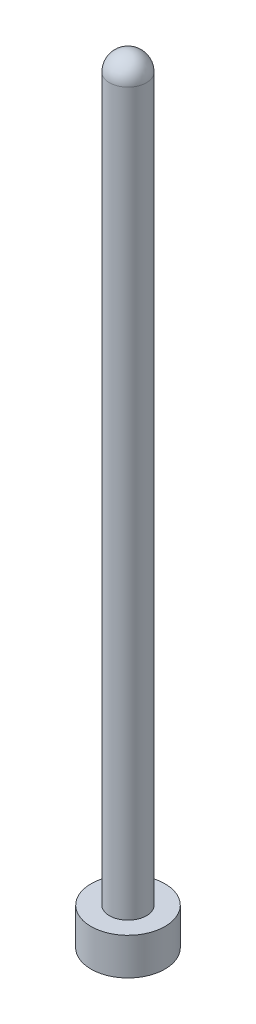
ISO-10303-21;
HEADER;
FILE_DESCRIPTION(('STEP AP214'),'2;1');
FILE_NAME('part.step','',(''),(''),'','','');
FILE_SCHEMA(('AUTOMOTIVE_DESIGN { 1 0 10303 214 1 1 1 1 }'));
ENDSEC;
DATA;
#1=APPLICATION_CONTEXT('core data for automotive mechanical design processes');
#2=APPLICATION_PROTOCOL_DEFINITION('international standard','automotive_design',2000,#1);
#3=PRODUCT_CONTEXT('',#1,'mechanical');
#4=PRODUCT('Part','Part','',(#3));
#5=PRODUCT_RELATED_PRODUCT_CATEGORY('part','',(#4));
#6=PRODUCT_DEFINITION_FORMATION('','',#4);
#7=PRODUCT_DEFINITION_CONTEXT('part definition',#1,'design');
#8=PRODUCT_DEFINITION('design','',#6,#7);
#9=PRODUCT_DEFINITION_SHAPE('','',#8);
#10=(LENGTH_UNIT() NAMED_UNIT(*) SI_UNIT(.MILLI.,.METRE.));
#11=(NAMED_UNIT(*) PLANE_ANGLE_UNIT() SI_UNIT($,.RADIAN.));
#12=(NAMED_UNIT(*) SI_UNIT($,.STERADIAN.) SOLID_ANGLE_UNIT());
#13=UNCERTAINTY_MEASURE_WITH_UNIT(LENGTH_MEASURE(1.E-05),#10,'distance_accuracy_value','');
#14=(GEOMETRIC_REPRESENTATION_CONTEXT(3) GLOBAL_UNCERTAINTY_ASSIGNED_CONTEXT((#13)) GLOBAL_UNIT_ASSIGNED_CONTEXT((#10,
#11,#12)) REPRESENTATION_CONTEXT('',''));
#15=CARTESIAN_POINT('',(0.,0.,0.));
#16=DIRECTION('',(0.,0.,1.));
#17=DIRECTION('',(1.,0.,0.));
#18=AXIS2_PLACEMENT_3D('',#15,#16,#17);
#19=CARTESIAN_POINT('',(0.,2.54,0.));
#20=DIRECTION('',(0.,-1.,0.));
#21=DIRECTION('',(0.,0.,-1.));
#22=AXIS2_PLACEMENT_3D('',#19,#20,#21);
#23=CYLINDRICAL_SURFACE('',#22,2.54);
#24=CARTESIAN_POINT('',(0.,2.54,0.));
#25=DIRECTION('',(0.,1.,0.));
#26=DIRECTION('',(0.,0.,1.));
#27=AXIS2_PLACEMENT_3D('',#24,#25,#26);
#28=CIRCLE('',#27,2.54);
#29=CARTESIAN_POINT('',(0.,2.54,2.54));
#30=VERTEX_POINT('',#29);
#31=EDGE_CURVE('E46',#30,#30,#28,.T.);
#32=ORIENTED_EDGE('',*,*,#31,.F.);
#33=EDGE_LOOP('',(#32));
#34=FACE_BOUND('',#33,.T.);
#35=CARTESIAN_POINT('',(0.,0.,0.));
#36=DIRECTION('',(0.,1.,0.));
#37=DIRECTION('',(0.,0.,1.));
#38=AXIS2_PLACEMENT_3D('',#35,#36,#37);
#39=CIRCLE('',#38,2.54);
#40=CARTESIAN_POINT('',(0.,0.,2.54));
#41=VERTEX_POINT('',#40);
#42=EDGE_CURVE('E51',#41,#41,#39,.T.);
#43=ORIENTED_EDGE('',*,*,#42,.T.);
#44=EDGE_LOOP('',(#43));
#45=FACE_BOUND('',#44,.T.);
#46=ADVANCED_FACE('F35',(#34,#45),#23,.T.);
#47=CARTESIAN_POINT('',(0.,2.54,0.));
#48=DIRECTION('',(0.,1.,0.));
#49=DIRECTION('',(0.,0.,1.));
#50=AXIS2_PLACEMENT_3D('',#47,#48,#49);
#51=PLANE('',#50);
#52=CARTESIAN_POINT('',(0.,2.54,0.));
#53=DIRECTION('',(0.,1.,0.));
#54=DIRECTION('',(0.,0.,1.));
#55=AXIS2_PLACEMENT_3D('',#52,#53,#54);
#56=CIRCLE('',#55,1.27);
#57=CARTESIAN_POINT('',(0.,2.54,1.27));
#58=VERTEX_POINT('',#57);
#59=EDGE_CURVE('E42',#58,#58,#56,.T.);
#60=ORIENTED_EDGE('',*,*,#59,.F.);
#61=EDGE_LOOP('',(#60));
#62=FACE_BOUND('',#61,.T.);
#63=ORIENTED_EDGE('',*,*,#31,.T.);
#64=EDGE_LOOP('',(#63));
#65=FACE_BOUND('',#64,.T.);
#66=ADVANCED_FACE('F72',(#62,#65),#51,.T.);
#67=CARTESIAN_POINT('',(0.,0.,0.));
#68=DIRECTION('',(0.,1.,0.));
#69=DIRECTION('',(0.,0.,1.));
#70=AXIS2_PLACEMENT_3D('',#67,#68,#69);
#71=PLANE('',#70);
#72=CARTESIAN_POINT('',(0.,0.,0.));
#73=DIRECTION('',(0.,-1.,0.));
#74=DIRECTION('',(0.,0.,-1.));
#75=AXIS2_PLACEMENT_3D('',#72,#73,#74);
#76=CIRCLE('',#75,1.27);
#77=CARTESIAN_POINT('',(0.,0.,-1.27));
#78=VERTEX_POINT('',#77);
#79=EDGE_CURVE('E54',#78,#78,#76,.T.);
#80=ORIENTED_EDGE('',*,*,#79,.F.);
#81=EDGE_LOOP('',(#80));
#82=FACE_BOUND('',#81,.T.);
#83=ORIENTED_EDGE('',*,*,#42,.F.);
#84=EDGE_LOOP('',(#83));
#85=FACE_BOUND('',#84,.T.);
#86=ADVANCED_FACE('F68',(#82,#85),#71,.F.);
#87=CARTESIAN_POINT('',(0.,53.34,0.));
#88=DIRECTION('',(0.,-1.,0.));
#89=DIRECTION('',(0.,0.,-1.));
#90=AXIS2_PLACEMENT_3D('',#87,#88,#89);
#91=CYLINDRICAL_SURFACE('',#90,1.27);
#92=CARTESIAN_POINT('',(0.,52.07,0.));
#93=DIRECTION('',(0.,-1.,0.));
#94=DIRECTION('',(0.,0.,-1.));
#95=AXIS2_PLACEMENT_3D('',#92,#93,#94);
#96=CIRCLE('',#95,1.27);
#97=CARTESIAN_POINT('',(0.,52.07,-1.27));
#98=VERTEX_POINT('',#97);
#99=EDGE_CURVE('E10',#98,#98,#96,.T.);
#100=ORIENTED_EDGE('',*,*,#99,.T.);
#101=EDGE_LOOP('',(#100));
#102=FACE_BOUND('',#101,.T.);
#103=ORIENTED_EDGE('',*,*,#59,.T.);
#104=EDGE_LOOP('',(#103));
#105=FACE_BOUND('',#104,.T.);
#106=ADVANCED_FACE('F71',(#102,#105),#91,.T.);
#107=CARTESIAN_POINT('',(0.,52.07,0.));
#108=DIRECTION('',(0.,1.,0.));
#109=DIRECTION('',(0.,0.,1.));
#110=AXIS2_PLACEMENT_3D('',#107,#108,#109);
#111=SPHERICAL_SURFACE('',#110,1.27);
#112=ORIENTED_EDGE('',*,*,#99,.F.);
#113=EDGE_LOOP('',(#112));
#114=FACE_BOUND('',#113,.T.);
#115=ADVANCED_FACE('F37',(#114),#111,.T.);
#116=CARTESIAN_POINT('',(0.,1.27,0.));
#117=DIRECTION('',(0.,-1.,0.));
#118=DIRECTION('',(0.,0.,-1.));
#119=AXIS2_PLACEMENT_3D('',#116,#117,#118);
#120=CYLINDRICAL_SURFACE('',#119,1.27);
#121=CARTESIAN_POINT('',(0.,1.27,0.));
#122=DIRECTION('',(0.,-1.,0.));
#123=DIRECTION('',(0.,0.,-1.));
#124=AXIS2_PLACEMENT_3D('',#121,#122,#123);
#125=CIRCLE('',#124,1.27);
#126=CARTESIAN_POINT('',(0.,1.27,-1.27));
#127=VERTEX_POINT('',#126);
#128=EDGE_CURVE('E57',#127,#127,#125,.T.);
#129=ORIENTED_EDGE('',*,*,#128,.F.);
#130=EDGE_LOOP('',(#129));
#131=FACE_BOUND('',#130,.T.);
#132=ORIENTED_EDGE('',*,*,#79,.T.);
#133=EDGE_LOOP('',(#132));
#134=FACE_BOUND('',#133,.T.);
#135=ADVANCED_FACE('F66',(#131,#134),#120,.F.);
#136=CARTESIAN_POINT('',(0.,1.27,0.));
#137=DIRECTION('',(0.,-1.,0.));
#138=DIRECTION('',(0.,0.,-1.));
#139=AXIS2_PLACEMENT_3D('',#136,#137,#138);
#140=PLANE('',#139);
#141=ORIENTED_EDGE('',*,*,#128,.T.);
#142=EDGE_LOOP('',(#141));
#143=FACE_BOUND('',#142,.T.);
#144=ADVANCED_FACE('F122',(#143),#140,.T.);
#145=CLOSED_SHELL('',(#46,#66,#86,#106,#115,#135,#144));
#146=MANIFOLD_SOLID_BREP('B2',#145);
#147=ADVANCED_BREP_SHAPE_REPRESENTATION('',(#18,#146),#14);
#148=SHAPE_DEFINITION_REPRESENTATION(#9,#147);
ENDSEC;
END-ISO-10303-21;
